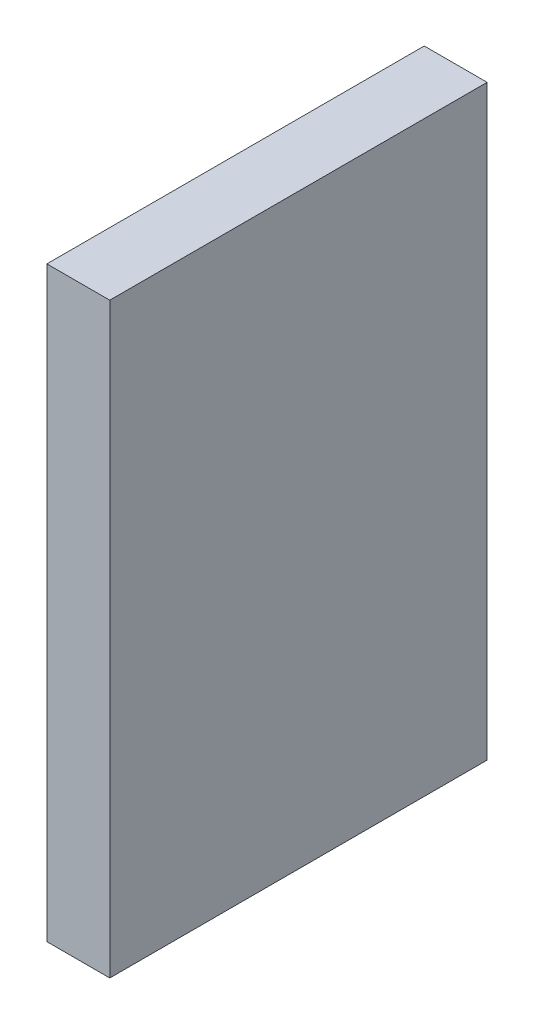
ISO-10303-21;
HEADER;
FILE_DESCRIPTION(('STEP AP214'),'2;1');
FILE_NAME('part.step','',(''),(''),'','','');
FILE_SCHEMA(('AUTOMOTIVE_DESIGN { 1 0 10303 214 1 1 1 1 }'));
ENDSEC;
DATA;
#1=APPLICATION_CONTEXT('core data for automotive mechanical design processes');
#2=APPLICATION_PROTOCOL_DEFINITION('international standard','automotive_design',2000,#1);
#3=PRODUCT_CONTEXT('',#1,'mechanical');
#4=PRODUCT('Part','Part','',(#3));
#5=PRODUCT_RELATED_PRODUCT_CATEGORY('part','',(#4));
#6=PRODUCT_DEFINITION_FORMATION('','',#4);
#7=PRODUCT_DEFINITION_CONTEXT('part definition',#1,'design');
#8=PRODUCT_DEFINITION('design','',#6,#7);
#9=PRODUCT_DEFINITION_SHAPE('','',#8);
#10=(LENGTH_UNIT() NAMED_UNIT(*) SI_UNIT(.MILLI.,.METRE.));
#11=(NAMED_UNIT(*) PLANE_ANGLE_UNIT() SI_UNIT($,.RADIAN.));
#12=(NAMED_UNIT(*) SI_UNIT($,.STERADIAN.) SOLID_ANGLE_UNIT());
#13=UNCERTAINTY_MEASURE_WITH_UNIT(LENGTH_MEASURE(1.E-05),#10,'distance_accuracy_value','');
#14=(GEOMETRIC_REPRESENTATION_CONTEXT(3) GLOBAL_UNCERTAINTY_ASSIGNED_CONTEXT((#13)) GLOBAL_UNIT_ASSIGNED_CONTEXT((#10,
#11,#12)) REPRESENTATION_CONTEXT('',''));
#15=CARTESIAN_POINT('',(0.,0.,0.));
#16=DIRECTION('',(0.,0.,1.));
#17=DIRECTION('',(1.,0.,0.));
#18=AXIS2_PLACEMENT_3D('',#15,#16,#17);
#19=CARTESIAN_POINT('',(0.,0.,14.));
#20=DIRECTION('',(0.,0.,1.));
#21=DIRECTION('',(1.,0.,0.));
#22=AXIS2_PLACEMENT_3D('',#19,#20,#21);
#23=PLANE('',#22);
#24=DIRECTION('',(-1.,0.,0.));
#25=VECTOR('',#24,1.);
#26=CARTESIAN_POINT('',(0.,-14.,14.));
#27=LINE('',#26,#25);
#28=CARTESIAN_POINT('',(1.5,-14.,14.));
#29=VERTEX_POINT('',#28);
#30=CARTESIAN_POINT('',(-1.5,-14.,14.));
#31=VERTEX_POINT('',#30);
#32=EDGE_CURVE('E9',#29,#31,#27,.T.);
#33=ORIENTED_EDGE('',*,*,#32,.F.);
#34=DIRECTION('',(0.,-1.,0.));
#35=VECTOR('',#34,1.);
#36=CARTESIAN_POINT('',(1.5,0.,14.));
#37=LINE('',#36,#35);
#38=CARTESIAN_POINT('',(1.5,14.,14.));
#39=VERTEX_POINT('',#38);
#40=EDGE_CURVE('E59',#39,#29,#37,.T.);
#41=ORIENTED_EDGE('',*,*,#40,.F.);
#42=DIRECTION('',(1.,0.,0.));
#43=VECTOR('',#42,1.);
#44=CARTESIAN_POINT('',(0.,14.,14.));
#45=LINE('',#44,#43);
#46=CARTESIAN_POINT('',(-1.5,14.,14.));
#47=VERTEX_POINT('',#46);
#48=EDGE_CURVE('E85',#47,#39,#45,.T.);
#49=ORIENTED_EDGE('',*,*,#48,.F.);
#50=DIRECTION('',(0.,1.,0.));
#51=VECTOR('',#50,1.);
#52=CARTESIAN_POINT('',(-1.5,0.,14.));
#53=LINE('',#52,#51);
#54=EDGE_CURVE('E22',#31,#47,#53,.T.);
#55=ORIENTED_EDGE('',*,*,#54,.F.);
#56=EDGE_LOOP('',(#33,#41,#49,#55));
#57=FACE_BOUND('',#56,.T.);
#58=ADVANCED_FACE('F15',(#57),#23,.T.);
#59=CARTESIAN_POINT('',(0.,-14.,-4.));
#60=DIRECTION('',(0.,-1.,0.));
#61=DIRECTION('',(0.,0.,-1.));
#62=AXIS2_PLACEMENT_3D('',#59,#60,#61);
#63=PLANE('',#62);
#64=DIRECTION('',(0.,0.,1.));
#65=VECTOR('',#64,1.);
#66=CARTESIAN_POINT('',(1.5,-14.,-4.));
#67=LINE('',#66,#65);
#68=CARTESIAN_POINT('',(1.5,-14.,-4.));
#69=VERTEX_POINT('',#68);
#70=EDGE_CURVE('E52',#69,#29,#67,.T.);
#71=ORIENTED_EDGE('',*,*,#70,.T.);
#72=ORIENTED_EDGE('',*,*,#32,.T.);
#73=DIRECTION('',(0.,0.,1.));
#74=VECTOR('',#73,1.);
#75=CARTESIAN_POINT('',(-1.5,-14.,-4.));
#76=LINE('',#75,#74);
#77=CARTESIAN_POINT('',(-1.5,-14.,-4.));
#78=VERTEX_POINT('',#77);
#79=EDGE_CURVE('E65',#78,#31,#76,.T.);
#80=ORIENTED_EDGE('',*,*,#79,.F.);
#81=DIRECTION('',(1.,0.,0.));
#82=VECTOR('',#81,1.);
#83=CARTESIAN_POINT('',(0.,-14.,-4.));
#84=LINE('',#83,#82);
#85=EDGE_CURVE('E63',#78,#69,#84,.T.);
#86=ORIENTED_EDGE('',*,*,#85,.T.);
#87=EDGE_LOOP('',(#71,#72,#80,#86));
#88=FACE_BOUND('',#87,.T.);
#89=ADVANCED_FACE('F64',(#88),#63,.T.);
#90=CARTESIAN_POINT('',(-1.5,0.,-4.));
#91=DIRECTION('',(-1.,0.,0.));
#92=DIRECTION('',(0.,0.,1.));
#93=AXIS2_PLACEMENT_3D('',#90,#91,#92);
#94=PLANE('',#93);
#95=ORIENTED_EDGE('',*,*,#79,.T.);
#96=ORIENTED_EDGE('',*,*,#54,.T.);
#97=DIRECTION('',(0.,0.,1.));
#98=VECTOR('',#97,1.);
#99=CARTESIAN_POINT('',(-1.5,14.,-4.));
#100=LINE('',#99,#98);
#101=CARTESIAN_POINT('',(-1.5,14.,-4.));
#102=VERTEX_POINT('',#101);
#103=EDGE_CURVE('E80',#102,#47,#100,.T.);
#104=ORIENTED_EDGE('',*,*,#103,.F.);
#105=DIRECTION('',(0.,-1.,0.));
#106=VECTOR('',#105,1.);
#107=CARTESIAN_POINT('',(-1.5,0.,-4.));
#108=LINE('',#107,#106);
#109=EDGE_CURVE('E69',#102,#78,#108,.T.);
#110=ORIENTED_EDGE('',*,*,#109,.T.);
#111=EDGE_LOOP('',(#95,#96,#104,#110));
#112=FACE_BOUND('',#111,.T.);
#113=ADVANCED_FACE('F89',(#112),#94,.T.);
#114=CARTESIAN_POINT('',(0.,14.,-4.));
#115=DIRECTION('',(0.,1.,0.));
#116=DIRECTION('',(0.,0.,1.));
#117=AXIS2_PLACEMENT_3D('',#114,#115,#116);
#118=PLANE('',#117);
#119=ORIENTED_EDGE('',*,*,#103,.T.);
#120=ORIENTED_EDGE('',*,*,#48,.T.);
#121=DIRECTION('',(0.,0.,1.));
#122=VECTOR('',#121,1.);
#123=CARTESIAN_POINT('',(1.5,14.,-4.));
#124=LINE('',#123,#122);
#125=CARTESIAN_POINT('',(1.5,14.,-4.));
#126=VERTEX_POINT('',#125);
#127=EDGE_CURVE('E60',#126,#39,#124,.T.);
#128=ORIENTED_EDGE('',*,*,#127,.F.);
#129=DIRECTION('',(-1.,0.,0.));
#130=VECTOR('',#129,1.);
#131=CARTESIAN_POINT('',(0.,14.,-4.));
#132=LINE('',#131,#130);
#133=EDGE_CURVE('E74',#126,#102,#132,.T.);
#134=ORIENTED_EDGE('',*,*,#133,.T.);
#135=EDGE_LOOP('',(#119,#120,#128,#134));
#136=FACE_BOUND('',#135,.T.);
#137=ADVANCED_FACE('F87',(#136),#118,.T.);
#138=CARTESIAN_POINT('',(0.,0.,-4.));
#139=DIRECTION('',(0.,0.,-1.));
#140=DIRECTION('',(-1.,0.,0.));
#141=AXIS2_PLACEMENT_3D('',#138,#139,#140);
#142=PLANE('',#141);
#143=DIRECTION('',(0.,1.,0.));
#144=VECTOR('',#143,1.);
#145=CARTESIAN_POINT('',(1.5,0.,-4.));
#146=LINE('',#145,#144);
#147=EDGE_CURVE('E57',#69,#126,#146,.T.);
#148=ORIENTED_EDGE('',*,*,#147,.F.);
#149=ORIENTED_EDGE('',*,*,#85,.F.);
#150=ORIENTED_EDGE('',*,*,#109,.F.);
#151=ORIENTED_EDGE('',*,*,#133,.F.);
#152=EDGE_LOOP('',(#148,#149,#150,#151));
#153=FACE_BOUND('',#152,.T.);
#154=ADVANCED_FACE('F72',(#153),#142,.T.);
#155=CARTESIAN_POINT('',(1.5,0.,-4.));
#156=DIRECTION('',(1.,0.,0.));
#157=DIRECTION('',(0.,0.,-1.));
#158=AXIS2_PLACEMENT_3D('',#155,#156,#157);
#159=PLANE('',#158);
#160=ORIENTED_EDGE('',*,*,#147,.T.);
#161=ORIENTED_EDGE('',*,*,#127,.T.);
#162=ORIENTED_EDGE('',*,*,#40,.T.);
#163=ORIENTED_EDGE('',*,*,#70,.F.);
#164=EDGE_LOOP('',(#160,#161,#162,#163));
#165=FACE_BOUND('',#164,.T.);
#166=ADVANCED_FACE('F54',(#165),#159,.T.);
#167=CLOSED_SHELL('',(#58,#89,#113,#137,#154,#166));
#168=MANIFOLD_SOLID_BREP('B1',#167);
#169=ADVANCED_BREP_SHAPE_REPRESENTATION('',(#18,#168),#14);
#170=SHAPE_DEFINITION_REPRESENTATION(#9,#169);
ENDSEC;
END-ISO-10303-21;
